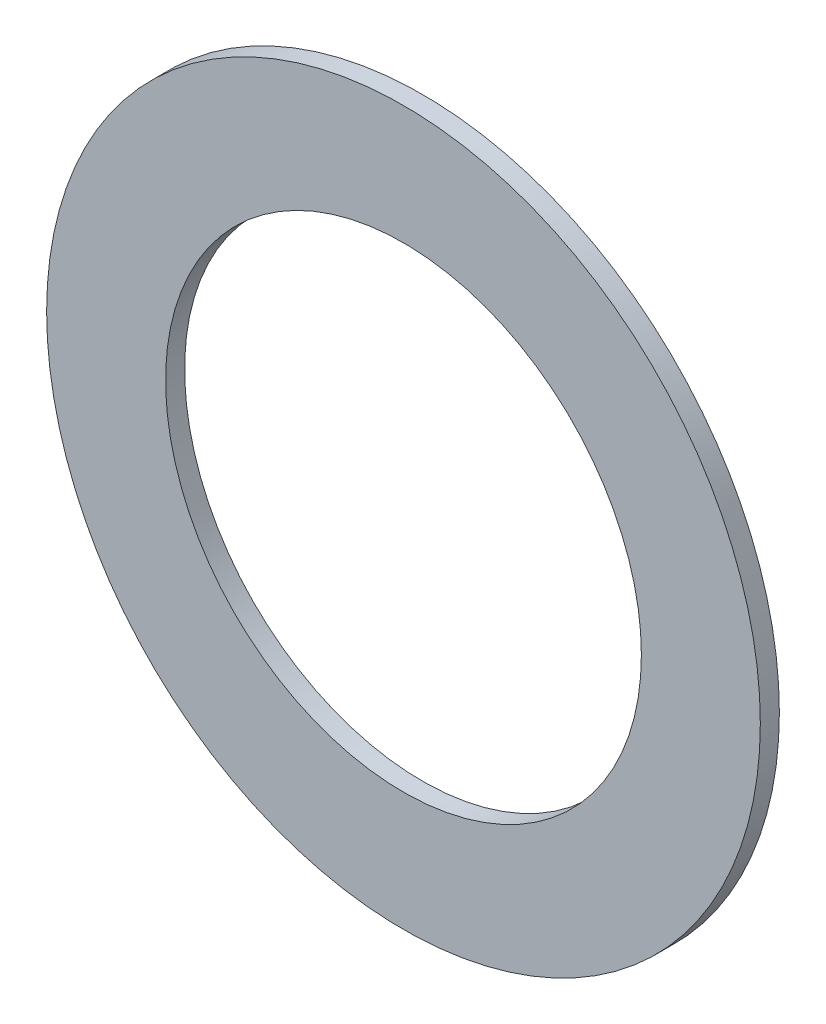
ISO-10303-21;
HEADER;
FILE_DESCRIPTION(('STEP AP214'),'2;1');
FILE_NAME('part.step','',(''),(''),'','','');
FILE_SCHEMA(('AUTOMOTIVE_DESIGN { 1 0 10303 214 1 1 1 1 }'));
ENDSEC;
DATA;
#1=APPLICATION_CONTEXT('core data for automotive mechanical design processes');
#2=APPLICATION_PROTOCOL_DEFINITION('international standard','automotive_design',2000,#1);
#3=PRODUCT_CONTEXT('',#1,'mechanical');
#4=PRODUCT('Part','Part','',(#3));
#5=PRODUCT_RELATED_PRODUCT_CATEGORY('part','',(#4));
#6=PRODUCT_DEFINITION_FORMATION('','',#4);
#7=PRODUCT_DEFINITION_CONTEXT('part definition',#1,'design');
#8=PRODUCT_DEFINITION('design','',#6,#7);
#9=PRODUCT_DEFINITION_SHAPE('','',#8);
#10=(LENGTH_UNIT() NAMED_UNIT(*) SI_UNIT(.MILLI.,.METRE.));
#11=(NAMED_UNIT(*) PLANE_ANGLE_UNIT() SI_UNIT($,.RADIAN.));
#12=(NAMED_UNIT(*) SI_UNIT($,.STERADIAN.) SOLID_ANGLE_UNIT());
#13=UNCERTAINTY_MEASURE_WITH_UNIT(LENGTH_MEASURE(1.E-05),#10,'distance_accuracy_value','');
#14=(GEOMETRIC_REPRESENTATION_CONTEXT(3) GLOBAL_UNCERTAINTY_ASSIGNED_CONTEXT((#13)) GLOBAL_UNIT_ASSIGNED_CONTEXT((#10,
#11,#12)) REPRESENTATION_CONTEXT('',''));
#15=CARTESIAN_POINT('',(0.,0.,0.));
#16=DIRECTION('',(0.,0.,1.));
#17=DIRECTION('',(1.,0.,0.));
#18=AXIS2_PLACEMENT_3D('',#15,#16,#17);
#19=CARTESIAN_POINT('',(0.,0.,0.127));
#20=DIRECTION('',(0.,0.,1.));
#21=DIRECTION('',(1.,0.,0.));
#22=AXIS2_PLACEMENT_3D('',#19,#20,#21);
#23=PLANE('',#22);
#24=CARTESIAN_POINT('',(0.,0.,0.127));
#25=DIRECTION('',(0.,0.,1.));
#26=DIRECTION('',(1.,0.,0.));
#27=AXIS2_PLACEMENT_3D('',#24,#25,#26);
#28=CIRCLE('',#27,4.7625);
#29=CARTESIAN_POINT('',(4.7625,0.,0.127));
#30=VERTEX_POINT('',#29);
#31=EDGE_CURVE('E10',#30,#30,#28,.T.);
#32=ORIENTED_EDGE('',*,*,#31,.T.);
#33=EDGE_LOOP('',(#32));
#34=FACE_BOUND('',#33,.T.);
#35=CARTESIAN_POINT('',(0.,0.,0.127));
#36=DIRECTION('',(0.,0.,1.));
#37=DIRECTION('',(1.,0.,0.));
#38=AXIS2_PLACEMENT_3D('',#35,#36,#37);
#39=CIRCLE('',#38,3.175);
#40=CARTESIAN_POINT('',(3.175,0.,0.127));
#41=VERTEX_POINT('',#40);
#42=EDGE_CURVE('E41',#41,#41,#39,.T.);
#43=ORIENTED_EDGE('',*,*,#42,.F.);
#44=EDGE_LOOP('',(#43));
#45=FACE_BOUND('',#44,.T.);
#46=ADVANCED_FACE('F30',(#34,#45),#23,.T.);
#47=CARTESIAN_POINT('',(0.,0.,-0.127));
#48=DIRECTION('',(0.,0.,1.));
#49=DIRECTION('',(1.,0.,0.));
#50=AXIS2_PLACEMENT_3D('',#47,#48,#49);
#51=PLANE('',#50);
#52=CARTESIAN_POINT('',(0.,0.,-0.127));
#53=DIRECTION('',(0.,0.,1.));
#54=DIRECTION('',(1.,0.,0.));
#55=AXIS2_PLACEMENT_3D('',#52,#53,#54);
#56=CIRCLE('',#55,4.7625);
#57=CARTESIAN_POINT('',(4.7625,0.,-0.127));
#58=VERTEX_POINT('',#57);
#59=EDGE_CURVE('E34',#58,#58,#56,.T.);
#60=ORIENTED_EDGE('',*,*,#59,.F.);
#61=EDGE_LOOP('',(#60));
#62=FACE_BOUND('',#61,.T.);
#63=CARTESIAN_POINT('',(0.,0.,-0.127));
#64=DIRECTION('',(0.,0.,1.));
#65=DIRECTION('',(1.,0.,0.));
#66=AXIS2_PLACEMENT_3D('',#63,#64,#65);
#67=CIRCLE('',#66,3.175);
#68=CARTESIAN_POINT('',(3.175,0.,-0.127));
#69=VERTEX_POINT('',#68);
#70=EDGE_CURVE('E43',#69,#69,#67,.T.);
#71=ORIENTED_EDGE('',*,*,#70,.T.);
#72=EDGE_LOOP('',(#71));
#73=FACE_BOUND('',#72,.T.);
#74=ADVANCED_FACE('F53',(#62,#73),#51,.F.);
#75=CARTESIAN_POINT('',(0.,0.,0.127));
#76=DIRECTION('',(0.,0.,-1.));
#77=DIRECTION('',(-1.,0.,0.));
#78=AXIS2_PLACEMENT_3D('',#75,#76,#77);
#79=CYLINDRICAL_SURFACE('',#78,4.7625);
#80=ORIENTED_EDGE('',*,*,#31,.F.);
#81=EDGE_LOOP('',(#80));
#82=FACE_BOUND('',#81,.T.);
#83=ORIENTED_EDGE('',*,*,#59,.T.);
#84=EDGE_LOOP('',(#83));
#85=FACE_BOUND('',#84,.T.);
#86=ADVANCED_FACE('F32',(#82,#85),#79,.T.);
#87=CARTESIAN_POINT('',(0.,0.,0.127));
#88=DIRECTION('',(0.,0.,-1.));
#89=DIRECTION('',(-1.,0.,0.));
#90=AXIS2_PLACEMENT_3D('',#87,#88,#89);
#91=CYLINDRICAL_SURFACE('',#90,3.175);
#92=ORIENTED_EDGE('',*,*,#42,.T.);
#93=EDGE_LOOP('',(#92));
#94=FACE_BOUND('',#93,.T.);
#95=ORIENTED_EDGE('',*,*,#70,.F.);
#96=EDGE_LOOP('',(#95));
#97=FACE_BOUND('',#96,.T.);
#98=ADVANCED_FACE('F49',(#94,#97),#91,.F.);
#99=CLOSED_SHELL('',(#46,#74,#86,#98));
#100=MANIFOLD_SOLID_BREP('B2',#99);
#101=ADVANCED_BREP_SHAPE_REPRESENTATION('',(#18,#100),#14);
#102=SHAPE_DEFINITION_REPRESENTATION(#9,#101);
ENDSEC;
END-ISO-10303-21;
